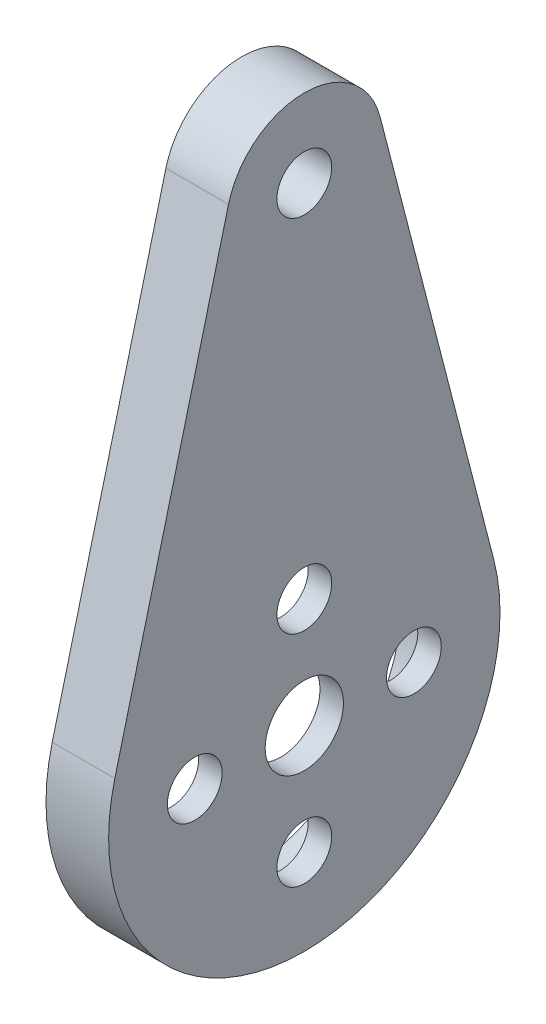
ISO-10303-21;
HEADER;
FILE_DESCRIPTION(('STEP AP214'),'2;1');
FILE_NAME('part.step','',(''),(''),'','','');
FILE_SCHEMA(('AUTOMOTIVE_DESIGN { 1 0 10303 214 1 1 1 1 }'));
ENDSEC;
DATA;
#1=APPLICATION_CONTEXT('core data for automotive mechanical design processes');
#2=APPLICATION_PROTOCOL_DEFINITION('international standard','automotive_design',2000,#1);
#3=PRODUCT_CONTEXT('',#1,'mechanical');
#4=PRODUCT('Part','Part','',(#3));
#5=PRODUCT_RELATED_PRODUCT_CATEGORY('part','',(#4));
#6=PRODUCT_DEFINITION_FORMATION('','',#4);
#7=PRODUCT_DEFINITION_CONTEXT('part definition',#1,'design');
#8=PRODUCT_DEFINITION('design','',#6,#7);
#9=PRODUCT_DEFINITION_SHAPE('','',#8);
#10=(LENGTH_UNIT() NAMED_UNIT(*) SI_UNIT(.MILLI.,.METRE.));
#11=(NAMED_UNIT(*) PLANE_ANGLE_UNIT() SI_UNIT($,.RADIAN.));
#12=(NAMED_UNIT(*) SI_UNIT($,.STERADIAN.) SOLID_ANGLE_UNIT());
#13=UNCERTAINTY_MEASURE_WITH_UNIT(LENGTH_MEASURE(1.E-05),#10,'distance_accuracy_value','');
#14=(GEOMETRIC_REPRESENTATION_CONTEXT(3) GLOBAL_UNCERTAINTY_ASSIGNED_CONTEXT((#13)) GLOBAL_UNIT_ASSIGNED_CONTEXT((#10,
#11,#12)) REPRESENTATION_CONTEXT('',''));
#15=CARTESIAN_POINT('',(0.,0.,0.));
#16=DIRECTION('',(0.,0.,1.));
#17=DIRECTION('',(1.,0.,0.));
#18=AXIS2_PLACEMENT_3D('',#15,#16,#17);
#19=CARTESIAN_POINT('',(4.,0.,0.));
#20=DIRECTION('',(-1.,0.,0.));
#21=DIRECTION('',(0.,0.,1.));
#22=AXIS2_PLACEMENT_3D('',#19,#20,#21);
#23=CYLINDRICAL_SURFACE('',#22,2.5);
#24=CARTESIAN_POINT('',(4.,0.,0.));
#25=DIRECTION('',(1.,0.,0.));
#26=DIRECTION('',(0.,0.,-1.));
#27=AXIS2_PLACEMENT_3D('',#24,#25,#26);
#28=CIRCLE('',#27,2.5);
#29=CARTESIAN_POINT('',(4.,0.,-2.5));
#30=VERTEX_POINT('',#29);
#31=EDGE_CURVE('E124',#30,#30,#28,.T.);
#32=ORIENTED_EDGE('',*,*,#31,.T.);
#33=EDGE_LOOP('',(#32));
#34=FACE_BOUND('',#33,.T.);
#35=CARTESIAN_POINT('',(2.5,0.,0.));
#36=DIRECTION('',(-1.,0.,0.));
#37=DIRECTION('',(0.,0.,1.));
#38=AXIS2_PLACEMENT_3D('',#35,#36,#37);
#39=CIRCLE('',#38,2.5);
#40=CARTESIAN_POINT('',(2.5,0.,2.5));
#41=VERTEX_POINT('',#40);
#42=EDGE_CURVE('E137',#41,#41,#39,.T.);
#43=ORIENTED_EDGE('',*,*,#42,.T.);
#44=EDGE_LOOP('',(#43));
#45=FACE_BOUND('',#44,.T.);
#46=ADVANCED_FACE('F39',(#34,#45),#23,.F.);
#47=CARTESIAN_POINT('',(0.,-7.,0.));
#48=DIRECTION('',(1.,0.,0.));
#49=DIRECTION('',(0.,0.,-1.));
#50=AXIS2_PLACEMENT_3D('',#47,#48,#49);
#51=CYLINDRICAL_SURFACE('',#50,1.75);
#52=CARTESIAN_POINT('',(4.,-7.,0.));
#53=DIRECTION('',(1.,0.,0.));
#54=DIRECTION('',(0.,0.,-1.));
#55=AXIS2_PLACEMENT_3D('',#52,#53,#54);
#56=CIRCLE('',#55,1.75);
#57=CARTESIAN_POINT('',(4.,-7.,-1.75));
#58=VERTEX_POINT('',#57);
#59=EDGE_CURVE('E129',#58,#58,#56,.T.);
#60=ORIENTED_EDGE('',*,*,#59,.T.);
#61=EDGE_LOOP('',(#60));
#62=FACE_BOUND('',#61,.T.);
#63=CARTESIAN_POINT('',(2.5,-7.,0.));
#64=DIRECTION('',(-1.,0.,0.));
#65=DIRECTION('',(0.,0.,1.));
#66=AXIS2_PLACEMENT_3D('',#63,#64,#65);
#67=CIRCLE('',#66,1.75);
#68=CARTESIAN_POINT('',(2.5,-7.,1.75));
#69=VERTEX_POINT('',#68);
#70=EDGE_CURVE('E144',#69,#69,#67,.F.);
#71=ORIENTED_EDGE('',*,*,#70,.F.);
#72=EDGE_LOOP('',(#71));
#73=FACE_BOUND('',#72,.T.);
#74=ADVANCED_FACE('F183',(#62,#73),#51,.F.);
#75=CARTESIAN_POINT('',(0.,0.,7.));
#76=DIRECTION('',(1.,0.,0.));
#77=DIRECTION('',(0.,0.,-1.));
#78=AXIS2_PLACEMENT_3D('',#75,#76,#77);
#79=CYLINDRICAL_SURFACE('',#78,1.75);
#80=CARTESIAN_POINT('',(4.,0.,7.));
#81=DIRECTION('',(1.,0.,0.));
#82=DIRECTION('',(0.,-1.,0.));
#83=AXIS2_PLACEMENT_3D('',#80,#81,#82);
#84=CIRCLE('',#83,1.75);
#85=CARTESIAN_POINT('',(4.,-1.75000000000007,6.99999999999998));
#86=VERTEX_POINT('',#85);
#87=EDGE_CURVE('E133',#86,#86,#84,.T.);
#88=ORIENTED_EDGE('',*,*,#87,.T.);
#89=EDGE_LOOP('',(#88));
#90=FACE_BOUND('',#89,.T.);
#91=CARTESIAN_POINT('',(2.5,0.,7.));
#92=DIRECTION('',(-1.,0.,0.));
#93=DIRECTION('',(0.,0.,1.));
#94=AXIS2_PLACEMENT_3D('',#91,#92,#93);
#95=CIRCLE('',#94,1.75);
#96=CARTESIAN_POINT('',(2.5,0.,8.75));
#97=VERTEX_POINT('',#96);
#98=EDGE_CURVE('E147',#97,#97,#95,.F.);
#99=ORIENTED_EDGE('',*,*,#98,.F.);
#100=EDGE_LOOP('',(#99));
#101=FACE_BOUND('',#100,.T.);
#102=ADVANCED_FACE('F178',(#90,#101),#79,.F.);
#103=CARTESIAN_POINT('',(0.,7.,0.));
#104=DIRECTION('',(1.,0.,0.));
#105=DIRECTION('',(0.,0.,-1.));
#106=AXIS2_PLACEMENT_3D('',#103,#104,#105);
#107=CYLINDRICAL_SURFACE('',#106,1.75);
#108=CARTESIAN_POINT('',(4.,7.,0.));
#109=DIRECTION('',(1.,0.,0.));
#110=DIRECTION('',(0.,0.,1.));
#111=AXIS2_PLACEMENT_3D('',#108,#109,#110);
#112=CIRCLE('',#111,1.75);
#113=CARTESIAN_POINT('',(4.,7.,1.75));
#114=VERTEX_POINT('',#113);
#115=EDGE_CURVE('E136',#114,#114,#112,.T.);
#116=ORIENTED_EDGE('',*,*,#115,.T.);
#117=EDGE_LOOP('',(#116));
#118=FACE_BOUND('',#117,.T.);
#119=CARTESIAN_POINT('',(2.5,7.,0.));
#120=DIRECTION('',(-1.,0.,0.));
#121=DIRECTION('',(0.,0.,1.));
#122=AXIS2_PLACEMENT_3D('',#119,#120,#121);
#123=CIRCLE('',#122,1.75);
#124=CARTESIAN_POINT('',(2.5,7.,1.75));
#125=VERTEX_POINT('',#124);
#126=EDGE_CURVE('E150',#125,#125,#123,.F.);
#127=ORIENTED_EDGE('',*,*,#126,.F.);
#128=EDGE_LOOP('',(#127));
#129=FACE_BOUND('',#128,.T.);
#130=ADVANCED_FACE('F168',(#118,#129),#107,.F.);
#131=CARTESIAN_POINT('',(0.,0.,-7.));
#132=DIRECTION('',(1.,0.,0.));
#133=DIRECTION('',(0.,0.,-1.));
#134=AXIS2_PLACEMENT_3D('',#131,#132,#133);
#135=CYLINDRICAL_SURFACE('',#134,1.75);
#136=CARTESIAN_POINT('',(4.,0.,-7.));
#137=DIRECTION('',(1.,0.,0.));
#138=DIRECTION('',(0.,1.,0.));
#139=AXIS2_PLACEMENT_3D('',#136,#137,#138);
#140=CIRCLE('',#139,1.75);
#141=CARTESIAN_POINT('',(4.,1.75000000000002,-6.99999999999999));
#142=VERTEX_POINT('',#141);
#143=EDGE_CURVE('E132',#142,#142,#140,.T.);
#144=ORIENTED_EDGE('',*,*,#143,.T.);
#145=EDGE_LOOP('',(#144));
#146=FACE_BOUND('',#145,.T.);
#147=CARTESIAN_POINT('',(2.5,0.,-7.));
#148=DIRECTION('',(-1.,0.,0.));
#149=DIRECTION('',(0.,0.,1.));
#150=AXIS2_PLACEMENT_3D('',#147,#148,#149);
#151=CIRCLE('',#150,1.75);
#152=CARTESIAN_POINT('',(2.5,0.,-5.25));
#153=VERTEX_POINT('',#152);
#154=EDGE_CURVE('E43',#153,#153,#151,.F.);
#155=ORIENTED_EDGE('',*,*,#154,.F.);
#156=EDGE_LOOP('',(#155));
#157=FACE_BOUND('',#156,.T.);
#158=ADVANCED_FACE('F166',(#146,#157),#135,.F.);
#159=CARTESIAN_POINT('',(4.,30.,0.));
#160=DIRECTION('',(1.,0.,0.));
#161=DIRECTION('',(0.,0.,-1.));
#162=AXIS2_PLACEMENT_3D('',#159,#160,#161);
#163=PLANE('',#162);
#164=ORIENTED_EDGE('',*,*,#143,.F.);
#165=EDGE_LOOP('',(#164));
#166=FACE_BOUND('',#165,.T.);
#167=ORIENTED_EDGE('',*,*,#115,.F.);
#168=EDGE_LOOP('',(#167));
#169=FACE_BOUND('',#168,.T.);
#170=ORIENTED_EDGE('',*,*,#87,.F.);
#171=EDGE_LOOP('',(#170));
#172=FACE_BOUND('',#171,.T.);
#173=ORIENTED_EDGE('',*,*,#59,.F.);
#174=EDGE_LOOP('',(#173));
#175=FACE_BOUND('',#174,.T.);
#176=CARTESIAN_POINT('',(4.,30.,0.));
#177=DIRECTION('',(1.,0.,0.));
#178=DIRECTION('',(0.,0.,-1.));
#179=AXIS2_PLACEMENT_3D('',#176,#177,#178);
#180=CIRCLE('',#179,1.75);
#181=CARTESIAN_POINT('',(4.,30.,-1.75));
#182=VERTEX_POINT('',#181);
#183=EDGE_CURVE('E109',#182,#182,#180,.T.);
#184=ORIENTED_EDGE('',*,*,#183,.F.);
#185=EDGE_LOOP('',(#184));
#186=FACE_BOUND('',#185,.T.);
#187=CARTESIAN_POINT('',(4.,30.,0.));
#188=DIRECTION('',(1.,0.,0.));
#189=DIRECTION('',(0.,0.,-1.));
#190=AXIS2_PLACEMENT_3D('',#187,#188,#189);
#191=CIRCLE('',#190,5.);
#192=CARTESIAN_POINT('',(4.,31.25,-4.84122918275928));
#193=VERTEX_POINT('',#192);
#194=CARTESIAN_POINT('',(4.,31.25,4.84122918275928));
#195=VERTEX_POINT('',#194);
#196=EDGE_CURVE('E93',#193,#195,#191,.T.);
#197=ORIENTED_EDGE('',*,*,#196,.T.);
#198=DIRECTION('',(0.,-0.968245836551854,0.25));
#199=VECTOR('',#198,1.);
#200=CARTESIAN_POINT('',(4.,31.25,4.84122918275928));
#201=LINE('',#200,#199);
#202=CARTESIAN_POINT('',(4.,3.12500000000001,12.1030729568982));
#203=VERTEX_POINT('',#202);
#204=EDGE_CURVE('E87',#195,#203,#201,.T.);
#205=ORIENTED_EDGE('',*,*,#204,.T.);
#206=CARTESIAN_POINT('',(4.,0.,0.));
#207=DIRECTION('',(1.,0.,0.));
#208=DIRECTION('',(0.,0.,-1.));
#209=AXIS2_PLACEMENT_3D('',#206,#207,#208);
#210=CIRCLE('',#209,12.5);
#211=CARTESIAN_POINT('',(4.,3.125,-12.1030729568982));
#212=VERTEX_POINT('',#211);
#213=EDGE_CURVE('E91',#203,#212,#210,.T.);
#214=ORIENTED_EDGE('',*,*,#213,.T.);
#215=DIRECTION('',(0.,0.968245836551854,0.25));
#216=VECTOR('',#215,1.);
#217=CARTESIAN_POINT('',(4.,31.25,-4.84122918275928));
#218=LINE('',#217,#216);
#219=EDGE_CURVE('E57',#212,#193,#218,.T.);
#220=ORIENTED_EDGE('',*,*,#219,.T.);
#221=EDGE_LOOP('',(#197,#205,#214,#220));
#222=FACE_BOUND('',#221,.T.);
#223=ORIENTED_EDGE('',*,*,#31,.F.);
#224=EDGE_LOOP('',(#223));
#225=FACE_BOUND('',#224,.T.);
#226=ADVANCED_FACE('F88',(#166,#169,#172,#175,#186,#222,#225),#163,.T.);
#227=CARTESIAN_POINT('',(0.,30.,0.));
#228=DIRECTION('',(1.,0.,0.));
#229=DIRECTION('',(0.,0.,-1.));
#230=AXIS2_PLACEMENT_3D('',#227,#228,#229);
#231=PLANE('',#230);
#232=CARTESIAN_POINT('',(0.,0.,0.));
#233=DIRECTION('',(-1.,0.,0.));
#234=DIRECTION('',(0.,0.,1.));
#235=AXIS2_PLACEMENT_3D('',#232,#233,#234);
#236=CIRCLE('',#235,10.25);
#237=CARTESIAN_POINT('',(0.,0.,10.25));
#238=VERTEX_POINT('',#237);
#239=EDGE_CURVE('E153',#238,#238,#236,.T.);
#240=ORIENTED_EDGE('',*,*,#239,.F.);
#241=EDGE_LOOP('',(#240));
#242=FACE_BOUND('',#241,.T.);
#243=CARTESIAN_POINT('',(0.,30.,0.));
#244=DIRECTION('',(1.,0.,0.));
#245=DIRECTION('',(0.,0.,-1.));
#246=AXIS2_PLACEMENT_3D('',#243,#244,#245);
#247=CIRCLE('',#246,5.);
#248=CARTESIAN_POINT('',(0.,31.25,-4.84122918275928));
#249=VERTEX_POINT('',#248);
#250=CARTESIAN_POINT('',(0.,31.25,4.84122918275928));
#251=VERTEX_POINT('',#250);
#252=EDGE_CURVE('E106',#249,#251,#247,.T.);
#253=ORIENTED_EDGE('',*,*,#252,.F.);
#254=DIRECTION('',(0.,0.968245836551854,0.25));
#255=VECTOR('',#254,1.);
#256=CARTESIAN_POINT('',(0.,31.25,-4.84122918275928));
#257=LINE('',#256,#255);
#258=CARTESIAN_POINT('',(0.,3.125,-12.1030729568982));
#259=VERTEX_POINT('',#258);
#260=EDGE_CURVE('E80',#259,#249,#257,.T.);
#261=ORIENTED_EDGE('',*,*,#260,.F.);
#262=CARTESIAN_POINT('',(0.,0.,0.));
#263=DIRECTION('',(1.,0.,0.));
#264=DIRECTION('',(0.,0.,-1.));
#265=AXIS2_PLACEMENT_3D('',#262,#263,#264);
#266=CIRCLE('',#265,12.5);
#267=CARTESIAN_POINT('',(0.,3.12500000000001,12.1030729568982));
#268=VERTEX_POINT('',#267);
#269=EDGE_CURVE('E74',#268,#259,#266,.T.);
#270=ORIENTED_EDGE('',*,*,#269,.F.);
#271=DIRECTION('',(0.,-0.968245836551854,0.25));
#272=VECTOR('',#271,1.);
#273=CARTESIAN_POINT('',(0.,31.25,4.84122918275928));
#274=LINE('',#273,#272);
#275=EDGE_CURVE('E97',#251,#268,#274,.T.);
#276=ORIENTED_EDGE('',*,*,#275,.F.);
#277=EDGE_LOOP('',(#253,#261,#270,#276));
#278=FACE_BOUND('',#277,.T.);
#279=CARTESIAN_POINT('',(0.,30.,0.));
#280=DIRECTION('',(1.,0.,0.));
#281=DIRECTION('',(0.,0.,-1.));
#282=AXIS2_PLACEMENT_3D('',#279,#280,#281);
#283=CIRCLE('',#282,1.75);
#284=CARTESIAN_POINT('',(0.,30.,-1.75));
#285=VERTEX_POINT('',#284);
#286=EDGE_CURVE('E121',#285,#285,#283,.T.);
#287=ORIENTED_EDGE('',*,*,#286,.T.);
#288=EDGE_LOOP('',(#287));
#289=FACE_BOUND('',#288,.T.);
#290=ADVANCED_FACE('F117',(#242,#278,#289),#231,.F.);
#291=CARTESIAN_POINT('',(4.,30.,0.));
#292=DIRECTION('',(-1.,0.,0.));
#293=DIRECTION('',(0.,0.,1.));
#294=AXIS2_PLACEMENT_3D('',#291,#292,#293);
#295=CYLINDRICAL_SURFACE('',#294,5.);
#296=ORIENTED_EDGE('',*,*,#252,.T.);
#297=DIRECTION('',(-1.,0.,0.));
#298=VECTOR('',#297,1.);
#299=CARTESIAN_POINT('',(4.,31.25,4.84122918275928));
#300=LINE('',#299,#298);
#301=EDGE_CURVE('E11',#195,#251,#300,.T.);
#302=ORIENTED_EDGE('',*,*,#301,.F.);
#303=ORIENTED_EDGE('',*,*,#196,.F.);
#304=DIRECTION('',(-1.,0.,0.));
#305=VECTOR('',#304,1.);
#306=CARTESIAN_POINT('',(4.,31.25,-4.84122918275928));
#307=LINE('',#306,#305);
#308=EDGE_CURVE('E102',#193,#249,#307,.T.);
#309=ORIENTED_EDGE('',*,*,#308,.T.);
#310=EDGE_LOOP('',(#296,#302,#303,#309));
#311=FACE_BOUND('',#310,.T.);
#312=ADVANCED_FACE('F41',(#311),#295,.T.);
#313=CARTESIAN_POINT('',(4.,31.25,4.84122918275928));
#314=DIRECTION('',(0.,-0.25,-0.968245836551854));
#315=DIRECTION('',(0.,0.968245836551854,-0.25));
#316=AXIS2_PLACEMENT_3D('',#313,#314,#315);
#317=PLANE('',#316);
#318=ORIENTED_EDGE('',*,*,#275,.T.);
#319=DIRECTION('',(-1.,0.,0.));
#320=VECTOR('',#319,1.);
#321=CARTESIAN_POINT('',(4.,3.12500000000001,12.1030729568982));
#322=LINE('',#321,#320);
#323=EDGE_CURVE('E49',#203,#268,#322,.T.);
#324=ORIENTED_EDGE('',*,*,#323,.F.);
#325=ORIENTED_EDGE('',*,*,#204,.F.);
#326=ORIENTED_EDGE('',*,*,#301,.T.);
#327=EDGE_LOOP('',(#318,#324,#325,#326));
#328=FACE_BOUND('',#327,.T.);
#329=ADVANCED_FACE('F96',(#328),#317,.F.);
#330=CARTESIAN_POINT('',(4.,0.,0.));
#331=DIRECTION('',(-1.,0.,0.));
#332=DIRECTION('',(0.,0.,1.));
#333=AXIS2_PLACEMENT_3D('',#330,#331,#332);
#334=CYLINDRICAL_SURFACE('',#333,12.5);
#335=ORIENTED_EDGE('',*,*,#269,.T.);
#336=DIRECTION('',(-1.,0.,0.));
#337=VECTOR('',#336,1.);
#338=CARTESIAN_POINT('',(4.,3.125,-12.1030729568982));
#339=LINE('',#338,#337);
#340=EDGE_CURVE('E98',#212,#259,#339,.T.);
#341=ORIENTED_EDGE('',*,*,#340,.F.);
#342=ORIENTED_EDGE('',*,*,#213,.F.);
#343=ORIENTED_EDGE('',*,*,#323,.T.);
#344=EDGE_LOOP('',(#335,#341,#342,#343));
#345=FACE_BOUND('',#344,.T.);
#346=ADVANCED_FACE('F100',(#345),#334,.T.);
#347=CARTESIAN_POINT('',(4.,31.25,-4.84122918275928));
#348=DIRECTION('',(0.,-0.25,0.968245836551854));
#349=DIRECTION('',(0.,-0.968245836551854,-0.25));
#350=AXIS2_PLACEMENT_3D('',#347,#348,#349);
#351=PLANE('',#350);
#352=ORIENTED_EDGE('',*,*,#260,.T.);
#353=ORIENTED_EDGE('',*,*,#308,.F.);
#354=ORIENTED_EDGE('',*,*,#219,.F.);
#355=ORIENTED_EDGE('',*,*,#340,.T.);
#356=EDGE_LOOP('',(#352,#353,#354,#355));
#357=FACE_BOUND('',#356,.T.);
#358=ADVANCED_FACE('F114',(#357),#351,.F.);
#359=CARTESIAN_POINT('',(4.,30.,0.));
#360=DIRECTION('',(-1.,0.,0.));
#361=DIRECTION('',(0.,0.,1.));
#362=AXIS2_PLACEMENT_3D('',#359,#360,#361);
#363=CYLINDRICAL_SURFACE('',#362,1.75);
#364=ORIENTED_EDGE('',*,*,#183,.T.);
#365=EDGE_LOOP('',(#364));
#366=FACE_BOUND('',#365,.T.);
#367=ORIENTED_EDGE('',*,*,#286,.F.);
#368=EDGE_LOOP('',(#367));
#369=FACE_BOUND('',#368,.T.);
#370=ADVANCED_FACE('F194',(#366,#369),#363,.F.);
#371=CARTESIAN_POINT('',(2.5,0.,0.));
#372=DIRECTION('',(-1.,0.,0.));
#373=DIRECTION('',(0.,0.,1.));
#374=AXIS2_PLACEMENT_3D('',#371,#372,#373);
#375=PLANE('',#374);
#376=ORIENTED_EDGE('',*,*,#42,.F.);
#377=EDGE_LOOP('',(#376));
#378=FACE_BOUND('',#377,.T.);
#379=CARTESIAN_POINT('',(2.5,0.,0.));
#380=DIRECTION('',(-1.,0.,0.));
#381=DIRECTION('',(0.,0.,1.));
#382=AXIS2_PLACEMENT_3D('',#379,#380,#381);
#383=CIRCLE('',#382,10.25);
#384=CARTESIAN_POINT('',(2.5,0.,10.25));
#385=VERTEX_POINT('',#384);
#386=EDGE_CURVE('E156',#385,#385,#383,.T.);
#387=ORIENTED_EDGE('',*,*,#386,.T.);
#388=EDGE_LOOP('',(#387));
#389=FACE_BOUND('',#388,.T.);
#390=ORIENTED_EDGE('',*,*,#154,.T.);
#391=EDGE_LOOP('',(#390));
#392=FACE_BOUND('',#391,.T.);
#393=ORIENTED_EDGE('',*,*,#126,.T.);
#394=EDGE_LOOP('',(#393));
#395=FACE_BOUND('',#394,.T.);
#396=ORIENTED_EDGE('',*,*,#98,.T.);
#397=EDGE_LOOP('',(#396));
#398=FACE_BOUND('',#397,.T.);
#399=ORIENTED_EDGE('',*,*,#70,.T.);
#400=EDGE_LOOP('',(#399));
#401=FACE_BOUND('',#400,.T.);
#402=ADVANCED_FACE('F163',(#378,#389,#392,#395,#398,#401),#375,.T.);
#403=CARTESIAN_POINT('',(2.5,0.,0.));
#404=DIRECTION('',(-1.,0.,0.));
#405=DIRECTION('',(0.,0.,1.));
#406=AXIS2_PLACEMENT_3D('',#403,#404,#405);
#407=CYLINDRICAL_SURFACE('',#406,10.25);
#408=ORIENTED_EDGE('',*,*,#386,.F.);
#409=EDGE_LOOP('',(#408));
#410=FACE_BOUND('',#409,.T.);
#411=ORIENTED_EDGE('',*,*,#239,.T.);
#412=EDGE_LOOP('',(#411));
#413=FACE_BOUND('',#412,.T.);
#414=ADVANCED_FACE('F271',(#410,#413),#407,.F.);
#415=CLOSED_SHELL('',(#46,#74,#102,#130,#158,#226,#290,#312,#329,#346,#358,#370,#402,#414));
#416=MANIFOLD_SOLID_BREP('B2',#415);
#417=ADVANCED_BREP_SHAPE_REPRESENTATION('',(#18,#416),#14);
#418=SHAPE_DEFINITION_REPRESENTATION(#9,#417);
ENDSEC;
END-ISO-10303-21;
